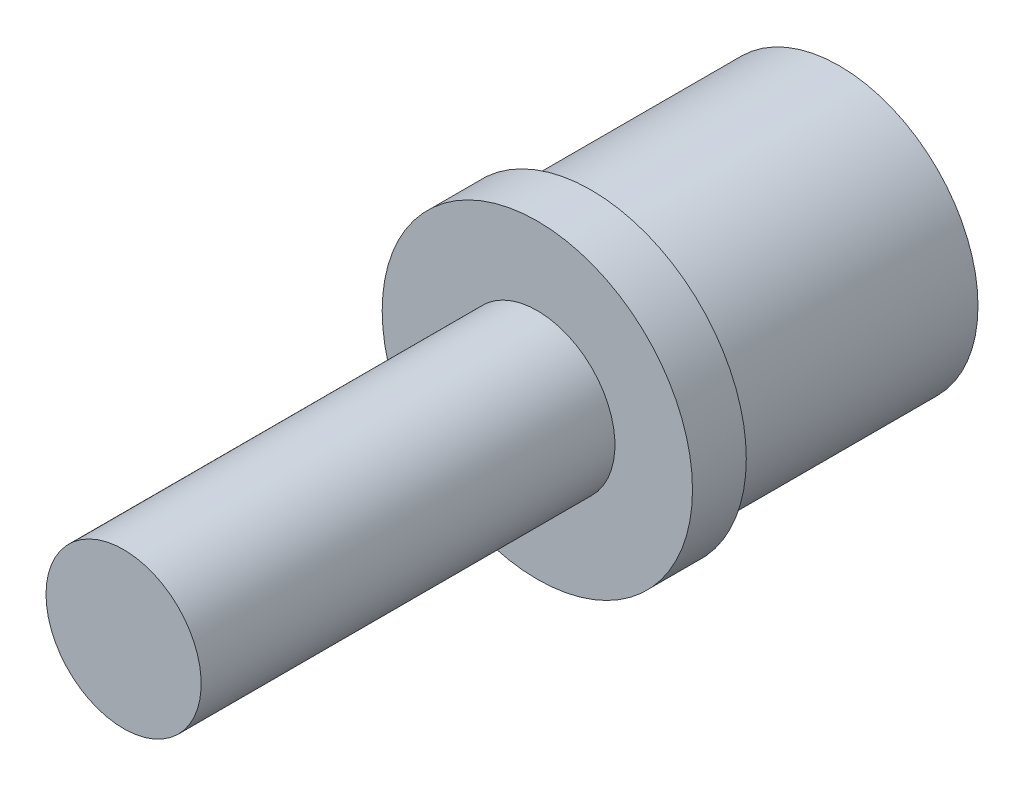
ISO-10303-21;
HEADER;
FILE_DESCRIPTION(('STEP AP214'),'2;1');
FILE_NAME('part.step','',(''),(''),'','','');
FILE_SCHEMA(('AUTOMOTIVE_DESIGN { 1 0 10303 214 1 1 1 1 }'));
ENDSEC;
DATA;
#1=APPLICATION_CONTEXT('core data for automotive mechanical design processes');
#2=APPLICATION_PROTOCOL_DEFINITION('international standard','automotive_design',2000,#1);
#3=PRODUCT_CONTEXT('',#1,'mechanical');
#4=PRODUCT('Part','Part','',(#3));
#5=PRODUCT_RELATED_PRODUCT_CATEGORY('part','',(#4));
#6=PRODUCT_DEFINITION_FORMATION('','',#4);
#7=PRODUCT_DEFINITION_CONTEXT('part definition',#1,'design');
#8=PRODUCT_DEFINITION('design','',#6,#7);
#9=PRODUCT_DEFINITION_SHAPE('','',#8);
#10=(LENGTH_UNIT() NAMED_UNIT(*) SI_UNIT(.MILLI.,.METRE.));
#11=(NAMED_UNIT(*) PLANE_ANGLE_UNIT() SI_UNIT($,.RADIAN.));
#12=(NAMED_UNIT(*) SI_UNIT($,.STERADIAN.) SOLID_ANGLE_UNIT());
#13=UNCERTAINTY_MEASURE_WITH_UNIT(LENGTH_MEASURE(1.E-05),#10,'distance_accuracy_value','');
#14=(GEOMETRIC_REPRESENTATION_CONTEXT(3) GLOBAL_UNCERTAINTY_ASSIGNED_CONTEXT((#13)) GLOBAL_UNIT_ASSIGNED_CONTEXT((#10,
#11,#12)) REPRESENTATION_CONTEXT('',''));
#15=CARTESIAN_POINT('',(0.,0.,0.));
#16=DIRECTION('',(0.,0.,1.));
#17=DIRECTION('',(1.,0.,0.));
#18=AXIS2_PLACEMENT_3D('',#15,#16,#17);
#19=CARTESIAN_POINT('',(0.,0.,43.942));
#20=DIRECTION('',(0.,0.,1.));
#21=DIRECTION('',(1.,0.,0.));
#22=AXIS2_PLACEMENT_3D('',#19,#20,#21);
#23=PLANE('',#22);
#24=CARTESIAN_POINT('',(0.,0.,43.942));
#25=DIRECTION('',(0.,0.,-1.));
#26=DIRECTION('',(-1.,0.,0.));
#27=AXIS2_PLACEMENT_3D('',#24,#25,#26);
#28=CIRCLE('',#27,4.7625);
#29=CARTESIAN_POINT('',(-4.7625,0.,43.942));
#30=VERTEX_POINT('',#29);
#31=EDGE_CURVE('E16',#30,#30,#28,.T.);
#32=ORIENTED_EDGE('',*,*,#31,.F.);
#33=EDGE_LOOP('',(#32));
#34=FACE_BOUND('',#33,.T.);
#35=ADVANCED_FACE('F13',(#34),#23,.T.);
#36=CARTESIAN_POINT('',(0.,0.,43.942));
#37=DIRECTION('',(0.,0.,-1.));
#38=DIRECTION('',(-1.,0.,0.));
#39=AXIS2_PLACEMENT_3D('',#36,#37,#38);
#40=CYLINDRICAL_SURFACE('',#39,4.7625);
#41=CARTESIAN_POINT('',(0.,0.,18.542));
#42=DIRECTION('',(0.,0.,-1.));
#43=DIRECTION('',(-1.,0.,0.));
#44=AXIS2_PLACEMENT_3D('',#41,#42,#43);
#45=CIRCLE('',#44,4.7625);
#46=CARTESIAN_POINT('',(-4.7625,0.,18.542));
#47=VERTEX_POINT('',#46);
#48=EDGE_CURVE('E32',#47,#47,#45,.T.);
#49=ORIENTED_EDGE('',*,*,#48,.F.);
#50=EDGE_LOOP('',(#49));
#51=FACE_BOUND('',#50,.T.);
#52=ORIENTED_EDGE('',*,*,#31,.T.);
#53=EDGE_LOOP('',(#52));
#54=FACE_BOUND('',#53,.T.);
#55=ADVANCED_FACE('F39',(#51,#54),#40,.T.);
#56=CARTESIAN_POINT('',(0.,0.,18.542));
#57=DIRECTION('',(0.,0.,1.));
#58=DIRECTION('',(1.,0.,0.));
#59=AXIS2_PLACEMENT_3D('',#56,#57,#58);
#60=PLANE('',#59);
#61=ORIENTED_EDGE('',*,*,#48,.T.);
#62=EDGE_LOOP('',(#61));
#63=FACE_BOUND('',#62,.T.);
#64=CARTESIAN_POINT('',(0.,0.,18.542));
#65=DIRECTION('',(0.,0.,-1.));
#66=DIRECTION('',(-1.,0.,0.));
#67=AXIS2_PLACEMENT_3D('',#64,#65,#66);
#68=CIRCLE('',#67,9.525);
#69=CARTESIAN_POINT('',(-9.525,0.,18.542));
#70=VERTEX_POINT('',#69);
#71=EDGE_CURVE('E30',#70,#70,#68,.T.);
#72=ORIENTED_EDGE('',*,*,#71,.F.);
#73=EDGE_LOOP('',(#72));
#74=FACE_BOUND('',#73,.T.);
#75=ADVANCED_FACE('F46',(#63,#74),#60,.T.);
#76=CARTESIAN_POINT('',(0.,0.,18.542));
#77=DIRECTION('',(0.,0.,-1.));
#78=DIRECTION('',(-1.,0.,0.));
#79=AXIS2_PLACEMENT_3D('',#76,#77,#78);
#80=CYLINDRICAL_SURFACE('',#79,9.525);
#81=ORIENTED_EDGE('',*,*,#71,.T.);
#82=EDGE_LOOP('',(#81));
#83=FACE_BOUND('',#82,.T.);
#84=CARTESIAN_POINT('',(0.,0.,15.24));
#85=DIRECTION('',(0.,0.,-1.));
#86=DIRECTION('',(-1.,0.,0.));
#87=AXIS2_PLACEMENT_3D('',#84,#85,#86);
#88=CIRCLE('',#87,9.525);
#89=CARTESIAN_POINT('',(-9.525,0.,15.24));
#90=VERTEX_POINT('',#89);
#91=EDGE_CURVE('E25',#90,#90,#88,.F.);
#92=ORIENTED_EDGE('',*,*,#91,.T.);
#93=EDGE_LOOP('',(#92));
#94=FACE_BOUND('',#93,.T.);
#95=ADVANCED_FACE('F62',(#83,#94),#80,.T.);
#96=CARTESIAN_POINT('',(0.,0.,15.24));
#97=DIRECTION('',(0.,0.,1.));
#98=DIRECTION('',(1.,0.,0.));
#99=AXIS2_PLACEMENT_3D('',#96,#97,#98);
#100=PLANE('',#99);
#101=CARTESIAN_POINT('',(0.,0.,15.24));
#102=DIRECTION('',(0.,0.,-1.));
#103=DIRECTION('',(-1.,0.,0.));
#104=AXIS2_PLACEMENT_3D('',#101,#102,#103);
#105=CIRCLE('',#104,8.509);
#106=CARTESIAN_POINT('',(-8.509,0.,15.24));
#107=VERTEX_POINT('',#106);
#108=EDGE_CURVE('E20',#107,#107,#105,.T.);
#109=ORIENTED_EDGE('',*,*,#108,.F.);
#110=EDGE_LOOP('',(#109));
#111=FACE_BOUND('',#110,.T.);
#112=ORIENTED_EDGE('',*,*,#91,.F.);
#113=EDGE_LOOP('',(#112));
#114=FACE_BOUND('',#113,.T.);
#115=ADVANCED_FACE('F55',(#111,#114),#100,.F.);
#116=CARTESIAN_POINT('',(0.,0.,0.));
#117=DIRECTION('',(0.,0.,1.));
#118=DIRECTION('',(1.,0.,0.));
#119=AXIS2_PLACEMENT_3D('',#116,#117,#118);
#120=PLANE('',#119);
#121=CARTESIAN_POINT('',(0.,0.,0.));
#122=DIRECTION('',(0.,0.,-1.));
#123=DIRECTION('',(-1.,0.,0.));
#124=AXIS2_PLACEMENT_3D('',#121,#122,#123);
#125=CIRCLE('',#124,8.509);
#126=CARTESIAN_POINT('',(-8.509,0.,0.));
#127=VERTEX_POINT('',#126);
#128=EDGE_CURVE('E9',#127,#127,#125,.F.);
#129=ORIENTED_EDGE('',*,*,#128,.F.);
#130=EDGE_LOOP('',(#129));
#131=FACE_BOUND('',#130,.T.);
#132=ADVANCED_FACE('F50',(#131),#120,.F.);
#133=CARTESIAN_POINT('',(0.,0.,15.24));
#134=DIRECTION('',(0.,0.,-1.));
#135=DIRECTION('',(-1.,0.,0.));
#136=AXIS2_PLACEMENT_3D('',#133,#134,#135);
#137=CYLINDRICAL_SURFACE('',#136,8.509);
#138=ORIENTED_EDGE('',*,*,#128,.T.);
#139=EDGE_LOOP('',(#138));
#140=FACE_BOUND('',#139,.T.);
#141=ORIENTED_EDGE('',*,*,#108,.T.);
#142=EDGE_LOOP('',(#141));
#143=FACE_BOUND('',#142,.T.);
#144=ADVANCED_FACE('F48',(#140,#143),#137,.T.);
#145=CLOSED_SHELL('',(#35,#55,#75,#95,#115,#132,#144));
#146=MANIFOLD_SOLID_BREP('B1',#145);
#147=ADVANCED_BREP_SHAPE_REPRESENTATION('',(#18,#146),#14);
#148=SHAPE_DEFINITION_REPRESENTATION(#9,#147);
ENDSEC;
END-ISO-10303-21;
